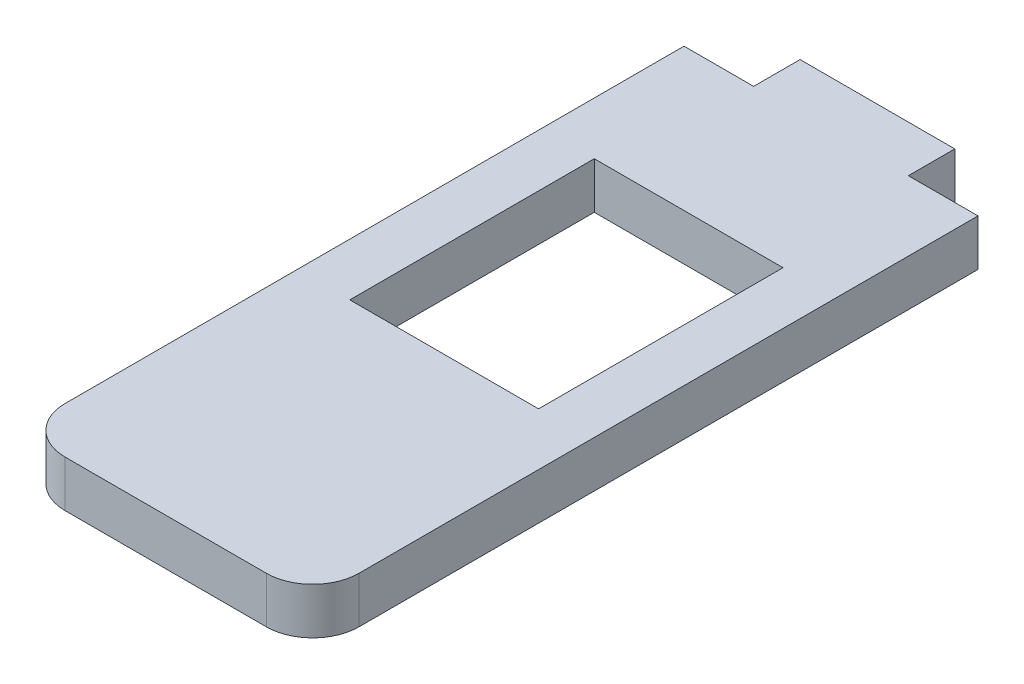
ISO-10303-21;
HEADER;
FILE_DESCRIPTION(('STEP AP214'),'2;1');
FILE_NAME('part.step','',(''),(''),'','','');
FILE_SCHEMA(('AUTOMOTIVE_DESIGN { 1 0 10303 214 1 1 1 1 }'));
ENDSEC;
DATA;
#1=APPLICATION_CONTEXT('core data for automotive mechanical design processes');
#2=APPLICATION_PROTOCOL_DEFINITION('international standard','automotive_design',2000,#1);
#3=PRODUCT_CONTEXT('',#1,'mechanical');
#4=PRODUCT('Part','Part','',(#3));
#5=PRODUCT_RELATED_PRODUCT_CATEGORY('part','',(#4));
#6=PRODUCT_DEFINITION_FORMATION('','',#4);
#7=PRODUCT_DEFINITION_CONTEXT('part definition',#1,'design');
#8=PRODUCT_DEFINITION('design','',#6,#7);
#9=PRODUCT_DEFINITION_SHAPE('','',#8);
#10=(LENGTH_UNIT() NAMED_UNIT(*) SI_UNIT(.MILLI.,.METRE.));
#11=(NAMED_UNIT(*) PLANE_ANGLE_UNIT() SI_UNIT($,.RADIAN.));
#12=(NAMED_UNIT(*) SI_UNIT($,.STERADIAN.) SOLID_ANGLE_UNIT());
#13=UNCERTAINTY_MEASURE_WITH_UNIT(LENGTH_MEASURE(1.E-05),#10,'distance_accuracy_value','');
#14=(GEOMETRIC_REPRESENTATION_CONTEXT(3) GLOBAL_UNCERTAINTY_ASSIGNED_CONTEXT((#13)) GLOBAL_UNIT_ASSIGNED_CONTEXT((#10,
#11,#12)) REPRESENTATION_CONTEXT('',''));
#15=CARTESIAN_POINT('',(0.,0.,0.));
#16=DIRECTION('',(0.,0.,1.));
#17=DIRECTION('',(1.,0.,0.));
#18=AXIS2_PLACEMENT_3D('',#15,#16,#17);
#19=CARTESIAN_POINT('',(6.5,3.,-3.));
#20=DIRECTION('',(0.,1.,0.));
#21=DIRECTION('',(0.,0.,1.));
#22=AXIS2_PLACEMENT_3D('',#19,#20,#21);
#23=PLANE('',#22);
#24=DIRECTION('',(0.,0.,1.));
#25=VECTOR('',#24,1.);
#26=CARTESIAN_POINT('',(-9.5,3.,-3.));
#27=LINE('',#26,#25);
#28=CARTESIAN_POINT('',(-9.5,3.,-43.));
#29=VERTEX_POINT('',#28);
#30=CARTESIAN_POINT('',(-9.5,3.,-3.));
#31=VERTEX_POINT('',#30);
#32=EDGE_CURVE('E170',#29,#31,#27,.T.);
#33=ORIENTED_EDGE('',*,*,#32,.T.);
#34=CARTESIAN_POINT('',(-6.5,3.,-3.));
#35=DIRECTION('',(0.,1.,0.));
#36=DIRECTION('',(0.,0.,-1.));
#37=AXIS2_PLACEMENT_3D('',#34,#35,#36);
#38=CIRCLE('',#37,3.);
#39=CARTESIAN_POINT('',(-6.5,3.,0.));
#40=VERTEX_POINT('',#39);
#41=EDGE_CURVE('E173',#31,#40,#38,.T.);
#42=ORIENTED_EDGE('',*,*,#41,.T.);
#43=DIRECTION('',(1.,0.,0.));
#44=VECTOR('',#43,1.);
#45=CARTESIAN_POINT('',(-6.5,3.,0.));
#46=LINE('',#45,#44);
#47=CARTESIAN_POINT('',(6.5,3.,0.));
#48=VERTEX_POINT('',#47);
#49=EDGE_CURVE('E176',#40,#48,#46,.T.);
#50=ORIENTED_EDGE('',*,*,#49,.T.);
#51=CARTESIAN_POINT('',(6.5,3.,-3.));
#52=DIRECTION('',(0.,1.,0.));
#53=DIRECTION('',(0.,0.,1.));
#54=AXIS2_PLACEMENT_3D('',#51,#52,#53);
#55=CIRCLE('',#54,3.);
#56=CARTESIAN_POINT('',(9.5,3.,-3.));
#57=VERTEX_POINT('',#56);
#58=EDGE_CURVE('E178',#48,#57,#55,.T.);
#59=ORIENTED_EDGE('',*,*,#58,.T.);
#60=DIRECTION('',(0.,0.,-1.));
#61=VECTOR('',#60,1.);
#62=CARTESIAN_POINT('',(9.5,3.,-3.));
#63=LINE('',#62,#61);
#64=CARTESIAN_POINT('',(9.5,3.,-43.));
#65=VERTEX_POINT('',#64);
#66=EDGE_CURVE('E180',#57,#65,#63,.T.);
#67=ORIENTED_EDGE('',*,*,#66,.T.);
#68=DIRECTION('',(-1.,0.,0.));
#69=VECTOR('',#68,1.);
#70=CARTESIAN_POINT('',(5.,3.,-43.));
#71=LINE('',#70,#69);
#72=CARTESIAN_POINT('',(5.,3.,-43.));
#73=VERTEX_POINT('',#72);
#74=EDGE_CURVE('E182',#65,#73,#71,.T.);
#75=ORIENTED_EDGE('',*,*,#74,.T.);
#76=DIRECTION('',(0.,0.,-1.));
#77=VECTOR('',#76,1.);
#78=CARTESIAN_POINT('',(5.,3.,-46.));
#79=LINE('',#78,#77);
#80=CARTESIAN_POINT('',(5.,3.,-46.));
#81=VERTEX_POINT('',#80);
#82=EDGE_CURVE('E184',#73,#81,#79,.T.);
#83=ORIENTED_EDGE('',*,*,#82,.T.);
#84=DIRECTION('',(-1.,0.,0.));
#85=VECTOR('',#84,1.);
#86=CARTESIAN_POINT('',(-5.,3.,-46.));
#87=LINE('',#86,#85);
#88=CARTESIAN_POINT('',(-5.,3.,-46.));
#89=VERTEX_POINT('',#88);
#90=EDGE_CURVE('E186',#81,#89,#87,.T.);
#91=ORIENTED_EDGE('',*,*,#90,.T.);
#92=DIRECTION('',(0.,0.,1.));
#93=VECTOR('',#92,1.);
#94=CARTESIAN_POINT('',(-5.,3.,-43.));
#95=LINE('',#94,#93);
#96=CARTESIAN_POINT('',(-5.,3.,-43.));
#97=VERTEX_POINT('',#96);
#98=EDGE_CURVE('E188',#89,#97,#95,.T.);
#99=ORIENTED_EDGE('',*,*,#98,.T.);
#100=DIRECTION('',(-1.,0.,0.));
#101=VECTOR('',#100,1.);
#102=CARTESIAN_POINT('',(-9.5,3.,-43.));
#103=LINE('',#102,#101);
#104=EDGE_CURVE('E190',#97,#29,#103,.T.);
#105=ORIENTED_EDGE('',*,*,#104,.T.);
#106=EDGE_LOOP('',(#33,#42,#50,#59,#67,#75,#83,#91,#99,#105));
#107=FACE_BOUND('',#106,.T.);
#108=DIRECTION('',(1.,0.,0.));
#109=VECTOR('',#108,1.);
#110=CARTESIAN_POINT('',(-6.1,3.,-18.));
#111=LINE('',#110,#109);
#112=CARTESIAN_POINT('',(-6.1,3.,-18.));
#113=VERTEX_POINT('',#112);
#114=CARTESIAN_POINT('',(6.1,3.,-18.));
#115=VERTEX_POINT('',#114);
#116=EDGE_CURVE('E142',#113,#115,#111,.T.);
#117=ORIENTED_EDGE('',*,*,#116,.F.);
#118=DIRECTION('',(0.,0.,1.));
#119=VECTOR('',#118,1.);
#120=CARTESIAN_POINT('',(-6.1,3.,-33.8));
#121=LINE('',#120,#119);
#122=CARTESIAN_POINT('',(-6.1,3.,-33.8));
#123=VERTEX_POINT('',#122);
#124=EDGE_CURVE('E134',#123,#113,#121,.T.);
#125=ORIENTED_EDGE('',*,*,#124,.F.);
#126=DIRECTION('',(-1.,0.,0.));
#127=VECTOR('',#126,1.);
#128=CARTESIAN_POINT('',(-6.1,3.,-33.8));
#129=LINE('',#128,#127);
#130=CARTESIAN_POINT('',(6.1,3.,-33.8));
#131=VERTEX_POINT('',#130);
#132=EDGE_CURVE('E156',#131,#123,#129,.T.);
#133=ORIENTED_EDGE('',*,*,#132,.F.);
#134=DIRECTION('',(0.,0.,-1.));
#135=VECTOR('',#134,1.);
#136=CARTESIAN_POINT('',(6.1,3.,-33.8));
#137=LINE('',#136,#135);
#138=EDGE_CURVE('E154',#115,#131,#137,.T.);
#139=ORIENTED_EDGE('',*,*,#138,.F.);
#140=EDGE_LOOP('',(#117,#125,#133,#139));
#141=FACE_BOUND('',#140,.T.);
#142=ADVANCED_FACE('F33',(#107,#141),#23,.T.);
#143=CARTESIAN_POINT('',(6.5,0.,-3.));
#144=DIRECTION('',(0.,1.,0.));
#145=DIRECTION('',(0.,0.,1.));
#146=AXIS2_PLACEMENT_3D('',#143,#144,#145);
#147=PLANE('',#146);
#148=DIRECTION('',(0.,0.,1.));
#149=VECTOR('',#148,1.);
#150=CARTESIAN_POINT('',(-9.5,0.,-3.));
#151=LINE('',#150,#149);
#152=CARTESIAN_POINT('',(-9.5,0.,-43.));
#153=VERTEX_POINT('',#152);
#154=CARTESIAN_POINT('',(-9.5,0.,-3.));
#155=VERTEX_POINT('',#154);
#156=EDGE_CURVE('E150',#153,#155,#151,.T.);
#157=ORIENTED_EDGE('',*,*,#156,.F.);
#158=DIRECTION('',(-1.,0.,0.));
#159=VECTOR('',#158,1.);
#160=CARTESIAN_POINT('',(-9.5,0.,-43.));
#161=LINE('',#160,#159);
#162=CARTESIAN_POINT('',(-5.,0.,-43.));
#163=VERTEX_POINT('',#162);
#164=EDGE_CURVE('E174',#163,#153,#161,.T.);
#165=ORIENTED_EDGE('',*,*,#164,.F.);
#166=DIRECTION('',(0.,0.,1.));
#167=VECTOR('',#166,1.);
#168=CARTESIAN_POINT('',(-5.,0.,-43.));
#169=LINE('',#168,#167);
#170=CARTESIAN_POINT('',(-5.,0.,-46.));
#171=VERTEX_POINT('',#170);
#172=EDGE_CURVE('E209',#171,#163,#169,.T.);
#173=ORIENTED_EDGE('',*,*,#172,.F.);
#174=DIRECTION('',(-1.,0.,0.));
#175=VECTOR('',#174,1.);
#176=CARTESIAN_POINT('',(-5.,0.,-46.));
#177=LINE('',#176,#175);
#178=CARTESIAN_POINT('',(5.,0.,-46.));
#179=VERTEX_POINT('',#178);
#180=EDGE_CURVE('E207',#179,#171,#177,.T.);
#181=ORIENTED_EDGE('',*,*,#180,.F.);
#182=DIRECTION('',(0.,0.,-1.));
#183=VECTOR('',#182,1.);
#184=CARTESIAN_POINT('',(5.,0.,-46.));
#185=LINE('',#184,#183);
#186=CARTESIAN_POINT('',(5.,0.,-43.));
#187=VERTEX_POINT('',#186);
#188=EDGE_CURVE('E205',#187,#179,#185,.T.);
#189=ORIENTED_EDGE('',*,*,#188,.F.);
#190=DIRECTION('',(-1.,0.,0.));
#191=VECTOR('',#190,1.);
#192=CARTESIAN_POINT('',(5.,0.,-43.));
#193=LINE('',#192,#191);
#194=CARTESIAN_POINT('',(9.5,0.,-43.));
#195=VERTEX_POINT('',#194);
#196=EDGE_CURVE('E203',#195,#187,#193,.T.);
#197=ORIENTED_EDGE('',*,*,#196,.F.);
#198=DIRECTION('',(0.,0.,-1.));
#199=VECTOR('',#198,1.);
#200=CARTESIAN_POINT('',(9.5,0.,-3.));
#201=LINE('',#200,#199);
#202=CARTESIAN_POINT('',(9.5,0.,-3.));
#203=VERTEX_POINT('',#202);
#204=EDGE_CURVE('E201',#203,#195,#201,.T.);
#205=ORIENTED_EDGE('',*,*,#204,.F.);
#206=CARTESIAN_POINT('',(6.5,0.,-3.));
#207=DIRECTION('',(0.,1.,0.));
#208=DIRECTION('',(0.,0.,1.));
#209=AXIS2_PLACEMENT_3D('',#206,#207,#208);
#210=CIRCLE('',#209,3.);
#211=CARTESIAN_POINT('',(6.5,0.,0.));
#212=VERTEX_POINT('',#211);
#213=EDGE_CURVE('E199',#212,#203,#210,.T.);
#214=ORIENTED_EDGE('',*,*,#213,.F.);
#215=DIRECTION('',(1.,0.,0.));
#216=VECTOR('',#215,1.);
#217=CARTESIAN_POINT('',(-6.5,0.,0.));
#218=LINE('',#217,#216);
#219=CARTESIAN_POINT('',(-6.5,0.,0.));
#220=VERTEX_POINT('',#219);
#221=EDGE_CURVE('E197',#220,#212,#218,.T.);
#222=ORIENTED_EDGE('',*,*,#221,.F.);
#223=CARTESIAN_POINT('',(-6.5,0.,-3.));
#224=DIRECTION('',(0.,1.,0.));
#225=DIRECTION('',(0.,0.,-1.));
#226=AXIS2_PLACEMENT_3D('',#223,#224,#225);
#227=CIRCLE('',#226,3.);
#228=EDGE_CURVE('E195',#155,#220,#227,.T.);
#229=ORIENTED_EDGE('',*,*,#228,.F.);
#230=EDGE_LOOP('',(#157,#165,#173,#181,#189,#197,#205,#214,#222,#229));
#231=FACE_BOUND('',#230,.T.);
#232=DIRECTION('',(0.,0.,1.));
#233=VECTOR('',#232,1.);
#234=CARTESIAN_POINT('',(-6.1,0.,-33.8));
#235=LINE('',#234,#233);
#236=CARTESIAN_POINT('',(-6.1,0.,-33.8));
#237=VERTEX_POINT('',#236);
#238=CARTESIAN_POINT('',(-6.1,0.,-18.));
#239=VERTEX_POINT('',#238);
#240=EDGE_CURVE('E56',#237,#239,#235,.T.);
#241=ORIENTED_EDGE('',*,*,#240,.T.);
#242=DIRECTION('',(1.,0.,0.));
#243=VECTOR('',#242,1.);
#244=CARTESIAN_POINT('',(-6.1,0.,-18.));
#245=LINE('',#244,#243);
#246=CARTESIAN_POINT('',(6.1,0.,-18.));
#247=VERTEX_POINT('',#246);
#248=EDGE_CURVE('E149',#239,#247,#245,.T.);
#249=ORIENTED_EDGE('',*,*,#248,.T.);
#250=DIRECTION('',(0.,0.,-1.));
#251=VECTOR('',#250,1.);
#252=CARTESIAN_POINT('',(6.1,0.,-33.8));
#253=LINE('',#252,#251);
#254=CARTESIAN_POINT('',(6.1,0.,-33.8));
#255=VERTEX_POINT('',#254);
#256=EDGE_CURVE('E162',#247,#255,#253,.T.);
#257=ORIENTED_EDGE('',*,*,#256,.T.);
#258=DIRECTION('',(-1.,0.,0.));
#259=VECTOR('',#258,1.);
#260=CARTESIAN_POINT('',(-6.1,0.,-33.8));
#261=LINE('',#260,#259);
#262=EDGE_CURVE('E143',#255,#237,#261,.T.);
#263=ORIENTED_EDGE('',*,*,#262,.T.);
#264=EDGE_LOOP('',(#241,#249,#257,#263));
#265=FACE_BOUND('',#264,.T.);
#266=ADVANCED_FACE('F245',(#231,#265),#147,.F.);
#267=CARTESIAN_POINT('',(-9.5,3.,-3.));
#268=DIRECTION('',(1.,0.,0.));
#269=DIRECTION('',(0.,0.,-1.));
#270=AXIS2_PLACEMENT_3D('',#267,#268,#269);
#271=PLANE('',#270);
#272=ORIENTED_EDGE('',*,*,#156,.T.);
#273=DIRECTION('',(0.,-1.,0.));
#274=VECTOR('',#273,1.);
#275=CARTESIAN_POINT('',(-9.5,3.,-3.));
#276=LINE('',#275,#274);
#277=EDGE_CURVE('E11',#31,#155,#276,.T.);
#278=ORIENTED_EDGE('',*,*,#277,.F.);
#279=ORIENTED_EDGE('',*,*,#32,.F.);
#280=DIRECTION('',(0.,-1.,0.));
#281=VECTOR('',#280,1.);
#282=CARTESIAN_POINT('',(-9.5,3.,-43.));
#283=LINE('',#282,#281);
#284=EDGE_CURVE('E192',#29,#153,#283,.T.);
#285=ORIENTED_EDGE('',*,*,#284,.T.);
#286=EDGE_LOOP('',(#272,#278,#279,#285));
#287=FACE_BOUND('',#286,.T.);
#288=ADVANCED_FACE('F35',(#287),#271,.F.);
#289=CARTESIAN_POINT('',(-6.5,3.,-3.));
#290=DIRECTION('',(0.,-1.,0.));
#291=DIRECTION('',(0.,0.,-1.));
#292=AXIS2_PLACEMENT_3D('',#289,#290,#291);
#293=CYLINDRICAL_SURFACE('',#292,3.);
#294=ORIENTED_EDGE('',*,*,#228,.T.);
#295=DIRECTION('',(0.,-1.,0.));
#296=VECTOR('',#295,1.);
#297=CARTESIAN_POINT('',(-6.5,3.,0.));
#298=LINE('',#297,#296);
#299=EDGE_CURVE('E41',#40,#220,#298,.T.);
#300=ORIENTED_EDGE('',*,*,#299,.F.);
#301=ORIENTED_EDGE('',*,*,#41,.F.);
#302=ORIENTED_EDGE('',*,*,#277,.T.);
#303=EDGE_LOOP('',(#294,#300,#301,#302));
#304=FACE_BOUND('',#303,.T.);
#305=ADVANCED_FACE('F262',(#304),#293,.T.);
#306=CARTESIAN_POINT('',(-6.5,3.,0.));
#307=DIRECTION('',(0.,0.,-1.));
#308=DIRECTION('',(-1.,0.,0.));
#309=AXIS2_PLACEMENT_3D('',#306,#307,#308);
#310=PLANE('',#309);
#311=ORIENTED_EDGE('',*,*,#221,.T.);
#312=DIRECTION('',(0.,-1.,0.));
#313=VECTOR('',#312,1.);
#314=CARTESIAN_POINT('',(6.5,3.,0.));
#315=LINE('',#314,#313);
#316=EDGE_CURVE('E232',#48,#212,#315,.T.);
#317=ORIENTED_EDGE('',*,*,#316,.F.);
#318=ORIENTED_EDGE('',*,*,#49,.F.);
#319=ORIENTED_EDGE('',*,*,#299,.T.);
#320=EDGE_LOOP('',(#311,#317,#318,#319));
#321=FACE_BOUND('',#320,.T.);
#322=ADVANCED_FACE('F239',(#321),#310,.F.);
#323=CARTESIAN_POINT('',(6.5,3.,-3.));
#324=DIRECTION('',(0.,-1.,0.));
#325=DIRECTION('',(0.,0.,-1.));
#326=AXIS2_PLACEMENT_3D('',#323,#324,#325);
#327=CYLINDRICAL_SURFACE('',#326,3.);
#328=ORIENTED_EDGE('',*,*,#213,.T.);
#329=DIRECTION('',(0.,-1.,0.));
#330=VECTOR('',#329,1.);
#331=CARTESIAN_POINT('',(9.5,3.,-3.));
#332=LINE('',#331,#330);
#333=EDGE_CURVE('E229',#57,#203,#332,.T.);
#334=ORIENTED_EDGE('',*,*,#333,.F.);
#335=ORIENTED_EDGE('',*,*,#58,.F.);
#336=ORIENTED_EDGE('',*,*,#316,.T.);
#337=EDGE_LOOP('',(#328,#334,#335,#336));
#338=FACE_BOUND('',#337,.T.);
#339=ADVANCED_FACE('F251',(#338),#327,.T.);
#340=CARTESIAN_POINT('',(9.5,3.,-3.));
#341=DIRECTION('',(-1.,0.,0.));
#342=DIRECTION('',(0.,0.,1.));
#343=AXIS2_PLACEMENT_3D('',#340,#341,#342);
#344=PLANE('',#343);
#345=ORIENTED_EDGE('',*,*,#204,.T.);
#346=DIRECTION('',(0.,-1.,0.));
#347=VECTOR('',#346,1.);
#348=CARTESIAN_POINT('',(9.5,3.,-43.));
#349=LINE('',#348,#347);
#350=EDGE_CURVE('E226',#65,#195,#349,.T.);
#351=ORIENTED_EDGE('',*,*,#350,.F.);
#352=ORIENTED_EDGE('',*,*,#66,.F.);
#353=ORIENTED_EDGE('',*,*,#333,.T.);
#354=EDGE_LOOP('',(#345,#351,#352,#353));
#355=FACE_BOUND('',#354,.T.);
#356=ADVANCED_FACE('F255',(#355),#344,.F.);
#357=CARTESIAN_POINT('',(5.,3.,-43.));
#358=DIRECTION('',(0.,0.,1.));
#359=DIRECTION('',(1.,0.,0.));
#360=AXIS2_PLACEMENT_3D('',#357,#358,#359);
#361=PLANE('',#360);
#362=ORIENTED_EDGE('',*,*,#196,.T.);
#363=DIRECTION('',(0.,-1.,0.));
#364=VECTOR('',#363,1.);
#365=CARTESIAN_POINT('',(5.,3.,-43.));
#366=LINE('',#365,#364);
#367=EDGE_CURVE('E223',#73,#187,#366,.T.);
#368=ORIENTED_EDGE('',*,*,#367,.F.);
#369=ORIENTED_EDGE('',*,*,#74,.F.);
#370=ORIENTED_EDGE('',*,*,#350,.T.);
#371=EDGE_LOOP('',(#362,#368,#369,#370));
#372=FACE_BOUND('',#371,.T.);
#373=ADVANCED_FACE('F285',(#372),#361,.F.);
#374=CARTESIAN_POINT('',(5.,3.,-46.));
#375=DIRECTION('',(-1.,0.,0.));
#376=DIRECTION('',(0.,0.,1.));
#377=AXIS2_PLACEMENT_3D('',#374,#375,#376);
#378=PLANE('',#377);
#379=ORIENTED_EDGE('',*,*,#188,.T.);
#380=DIRECTION('',(0.,-1.,0.));
#381=VECTOR('',#380,1.);
#382=CARTESIAN_POINT('',(5.,3.,-46.));
#383=LINE('',#382,#381);
#384=EDGE_CURVE('E220',#81,#179,#383,.T.);
#385=ORIENTED_EDGE('',*,*,#384,.F.);
#386=ORIENTED_EDGE('',*,*,#82,.F.);
#387=ORIENTED_EDGE('',*,*,#367,.T.);
#388=EDGE_LOOP('',(#379,#385,#386,#387));
#389=FACE_BOUND('',#388,.T.);
#390=ADVANCED_FACE('F282',(#389),#378,.F.);
#391=CARTESIAN_POINT('',(-5.,3.,-46.));
#392=DIRECTION('',(0.,0.,1.));
#393=DIRECTION('',(1.,0.,0.));
#394=AXIS2_PLACEMENT_3D('',#391,#392,#393);
#395=PLANE('',#394);
#396=ORIENTED_EDGE('',*,*,#180,.T.);
#397=DIRECTION('',(0.,-1.,0.));
#398=VECTOR('',#397,1.);
#399=CARTESIAN_POINT('',(-5.,3.,-46.));
#400=LINE('',#399,#398);
#401=EDGE_CURVE('E217',#89,#171,#400,.T.);
#402=ORIENTED_EDGE('',*,*,#401,.F.);
#403=ORIENTED_EDGE('',*,*,#90,.F.);
#404=ORIENTED_EDGE('',*,*,#384,.T.);
#405=EDGE_LOOP('',(#396,#402,#403,#404));
#406=FACE_BOUND('',#405,.T.);
#407=ADVANCED_FACE('F278',(#406),#395,.F.);
#408=CARTESIAN_POINT('',(-5.,3.,-43.));
#409=DIRECTION('',(1.,0.,0.));
#410=DIRECTION('',(0.,0.,-1.));
#411=AXIS2_PLACEMENT_3D('',#408,#409,#410);
#412=PLANE('',#411);
#413=ORIENTED_EDGE('',*,*,#172,.T.);
#414=DIRECTION('',(0.,-1.,0.));
#415=VECTOR('',#414,1.);
#416=CARTESIAN_POINT('',(-5.,3.,-43.));
#417=LINE('',#416,#415);
#418=EDGE_CURVE('E214',#97,#163,#417,.T.);
#419=ORIENTED_EDGE('',*,*,#418,.F.);
#420=ORIENTED_EDGE('',*,*,#98,.F.);
#421=ORIENTED_EDGE('',*,*,#401,.T.);
#422=EDGE_LOOP('',(#413,#419,#420,#421));
#423=FACE_BOUND('',#422,.T.);
#424=ADVANCED_FACE('F274',(#423),#412,.F.);
#425=CARTESIAN_POINT('',(-9.5,3.,-43.));
#426=DIRECTION('',(0.,0.,1.));
#427=DIRECTION('',(1.,0.,0.));
#428=AXIS2_PLACEMENT_3D('',#425,#426,#427);
#429=PLANE('',#428);
#430=ORIENTED_EDGE('',*,*,#164,.T.);
#431=ORIENTED_EDGE('',*,*,#284,.F.);
#432=ORIENTED_EDGE('',*,*,#104,.F.);
#433=ORIENTED_EDGE('',*,*,#418,.T.);
#434=EDGE_LOOP('',(#430,#431,#432,#433));
#435=FACE_BOUND('',#434,.T.);
#436=ADVANCED_FACE('F269',(#435),#429,.F.);
#437=CARTESIAN_POINT('',(-6.1,3.,-33.8));
#438=DIRECTION('',(1.,0.,0.));
#439=DIRECTION('',(0.,0.,-1.));
#440=AXIS2_PLACEMENT_3D('',#437,#438,#439);
#441=PLANE('',#440);
#442=ORIENTED_EDGE('',*,*,#240,.F.);
#443=DIRECTION('',(0.,-1.,0.));
#444=VECTOR('',#443,1.);
#445=CARTESIAN_POINT('',(-6.1,3.,-33.8));
#446=LINE('',#445,#444);
#447=EDGE_CURVE('E138',#123,#237,#446,.T.);
#448=ORIENTED_EDGE('',*,*,#447,.F.);
#449=ORIENTED_EDGE('',*,*,#124,.T.);
#450=DIRECTION('',(0.,-1.,0.));
#451=VECTOR('',#450,1.);
#452=CARTESIAN_POINT('',(-6.1,3.,-18.));
#453=LINE('',#452,#451);
#454=EDGE_CURVE('E137',#113,#239,#453,.T.);
#455=ORIENTED_EDGE('',*,*,#454,.T.);
#456=EDGE_LOOP('',(#442,#448,#449,#455));
#457=FACE_BOUND('',#456,.T.);
#458=ADVANCED_FACE('F136',(#457),#441,.T.);
#459=CARTESIAN_POINT('',(-6.1,3.,-18.));
#460=DIRECTION('',(0.,0.,-1.));
#461=DIRECTION('',(-1.,0.,0.));
#462=AXIS2_PLACEMENT_3D('',#459,#460,#461);
#463=PLANE('',#462);
#464=ORIENTED_EDGE('',*,*,#248,.F.);
#465=ORIENTED_EDGE('',*,*,#454,.F.);
#466=ORIENTED_EDGE('',*,*,#116,.T.);
#467=DIRECTION('',(0.,-1.,0.));
#468=VECTOR('',#467,1.);
#469=CARTESIAN_POINT('',(6.1,3.,-18.));
#470=LINE('',#469,#468);
#471=EDGE_CURVE('E151',#115,#247,#470,.T.);
#472=ORIENTED_EDGE('',*,*,#471,.T.);
#473=EDGE_LOOP('',(#464,#465,#466,#472));
#474=FACE_BOUND('',#473,.T.);
#475=ADVANCED_FACE('F146',(#474),#463,.T.);
#476=CARTESIAN_POINT('',(6.1,3.,-33.8));
#477=DIRECTION('',(-1.,0.,0.));
#478=DIRECTION('',(0.,0.,1.));
#479=AXIS2_PLACEMENT_3D('',#476,#477,#478);
#480=PLANE('',#479);
#481=ORIENTED_EDGE('',*,*,#256,.F.);
#482=ORIENTED_EDGE('',*,*,#471,.F.);
#483=ORIENTED_EDGE('',*,*,#138,.T.);
#484=DIRECTION('',(0.,-1.,0.));
#485=VECTOR('',#484,1.);
#486=CARTESIAN_POINT('',(6.1,3.,-33.8));
#487=LINE('',#486,#485);
#488=EDGE_CURVE('E48',#131,#255,#487,.T.);
#489=ORIENTED_EDGE('',*,*,#488,.T.);
#490=EDGE_LOOP('',(#481,#482,#483,#489));
#491=FACE_BOUND('',#490,.T.);
#492=ADVANCED_FACE('F331',(#491),#480,.T.);
#493=CARTESIAN_POINT('',(-6.1,3.,-33.8));
#494=DIRECTION('',(0.,0.,1.));
#495=DIRECTION('',(1.,0.,0.));
#496=AXIS2_PLACEMENT_3D('',#493,#494,#495);
#497=PLANE('',#496);
#498=ORIENTED_EDGE('',*,*,#262,.F.);
#499=ORIENTED_EDGE('',*,*,#488,.F.);
#500=ORIENTED_EDGE('',*,*,#132,.T.);
#501=ORIENTED_EDGE('',*,*,#447,.T.);
#502=EDGE_LOOP('',(#498,#499,#500,#501));
#503=FACE_BOUND('',#502,.T.);
#504=ADVANCED_FACE('F337',(#503),#497,.T.);
#505=CLOSED_SHELL('',(#142,#266,#288,#305,#322,#339,#356,#373,#390,#407,#424,#436,#458,#475,
#492,#504));
#506=MANIFOLD_SOLID_BREP('B2',#505);
#507=ADVANCED_BREP_SHAPE_REPRESENTATION('',(#18,#506),#14);
#508=SHAPE_DEFINITION_REPRESENTATION(#9,#507);
ENDSEC;
END-ISO-10303-21;
